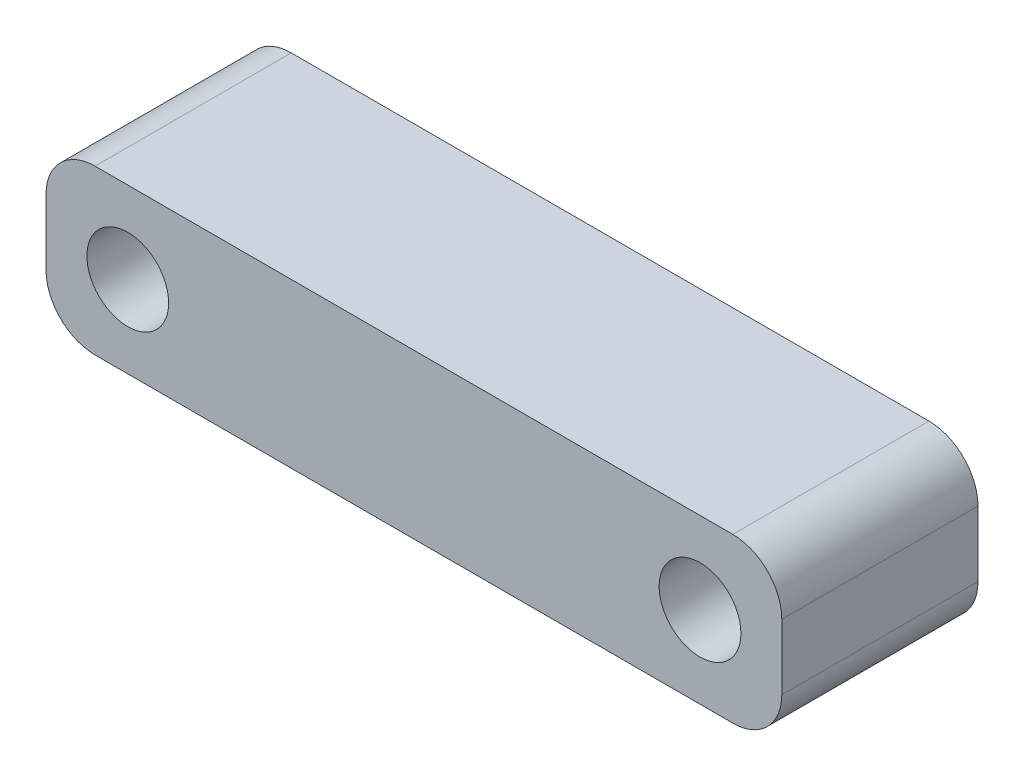
ISO-10303-21;
HEADER;
FILE_DESCRIPTION(('STEP AP214'),'2;1');
FILE_NAME('part.step','',(''),(''),'','','');
FILE_SCHEMA(('AUTOMOTIVE_DESIGN { 1 0 10303 214 1 1 1 1 }'));
ENDSEC;
DATA;
#1=APPLICATION_CONTEXT('core data for automotive mechanical design processes');
#2=APPLICATION_PROTOCOL_DEFINITION('international standard','automotive_design',2000,#1);
#3=PRODUCT_CONTEXT('',#1,'mechanical');
#4=PRODUCT('Part','Part','',(#3));
#5=PRODUCT_RELATED_PRODUCT_CATEGORY('part','',(#4));
#6=PRODUCT_DEFINITION_FORMATION('','',#4);
#7=PRODUCT_DEFINITION_CONTEXT('part definition',#1,'design');
#8=PRODUCT_DEFINITION('design','',#6,#7);
#9=PRODUCT_DEFINITION_SHAPE('','',#8);
#10=(LENGTH_UNIT() NAMED_UNIT(*) SI_UNIT(.MILLI.,.METRE.));
#11=(NAMED_UNIT(*) PLANE_ANGLE_UNIT() SI_UNIT($,.RADIAN.));
#12=(NAMED_UNIT(*) SI_UNIT($,.STERADIAN.) SOLID_ANGLE_UNIT());
#13=UNCERTAINTY_MEASURE_WITH_UNIT(LENGTH_MEASURE(1.E-05),#10,'distance_accuracy_value','');
#14=(GEOMETRIC_REPRESENTATION_CONTEXT(3) GLOBAL_UNCERTAINTY_ASSIGNED_CONTEXT((#13)) GLOBAL_UNIT_ASSIGNED_CONTEXT((#10,
#11,#12)) REPRESENTATION_CONTEXT('',''));
#15=CARTESIAN_POINT('',(0.,0.,0.));
#16=DIRECTION('',(0.,0.,1.));
#17=DIRECTION('',(1.,0.,0.));
#18=AXIS2_PLACEMENT_3D('',#15,#16,#17);
#19=CARTESIAN_POINT('',(37.,2.,12.));
#20=DIRECTION('',(0.,0.,-1.));
#21=DIRECTION('',(-1.,0.,0.));
#22=AXIS2_PLACEMENT_3D('',#19,#20,#21);
#23=PLANE('',#22);
#24=CARTESIAN_POINT('',(37.,2.,12.));
#25=DIRECTION('',(0.,0.,1.));
#26=DIRECTION('',(-1.,0.,0.));
#27=AXIS2_PLACEMENT_3D('',#24,#25,#26);
#28=CIRCLE('',#27,3.);
#29=CARTESIAN_POINT('',(40.,1.99999999999998,12.));
#30=VERTEX_POINT('',#29);
#31=CARTESIAN_POINT('',(37.,5.,12.));
#32=VERTEX_POINT('',#31);
#33=EDGE_CURVE('E151',#30,#32,#28,.T.);
#34=ORIENTED_EDGE('',*,*,#33,.T.);
#35=DIRECTION('',(-1.,0.,0.));
#36=VECTOR('',#35,1.);
#37=CARTESIAN_POINT('',(-1.99999999999998,5.,12.));
#38=LINE('',#37,#36);
#39=CARTESIAN_POINT('',(-1.99999999999998,5.,12.));
#40=VERTEX_POINT('',#39);
#41=EDGE_CURVE('E99',#32,#40,#38,.T.);
#42=ORIENTED_EDGE('',*,*,#41,.T.);
#43=CARTESIAN_POINT('',(-2.,2.,12.));
#44=DIRECTION('',(0.,0.,1.));
#45=DIRECTION('',(1.,0.,0.));
#46=AXIS2_PLACEMENT_3D('',#43,#44,#45);
#47=CIRCLE('',#46,3.);
#48=CARTESIAN_POINT('',(-5.,1.99999999999998,12.));
#49=VERTEX_POINT('',#48);
#50=EDGE_CURVE('E166',#40,#49,#47,.T.);
#51=ORIENTED_EDGE('',*,*,#50,.T.);
#52=DIRECTION('',(0.,-1.,0.));
#53=VECTOR('',#52,1.);
#54=CARTESIAN_POINT('',(-5.,1.99999999999998,12.));
#55=LINE('',#54,#53);
#56=CARTESIAN_POINT('',(-5.,-1.99999999999998,12.));
#57=VERTEX_POINT('',#56);
#58=EDGE_CURVE('E179',#49,#57,#55,.T.);
#59=ORIENTED_EDGE('',*,*,#58,.T.);
#60=CARTESIAN_POINT('',(-2.,-2.,12.));
#61=DIRECTION('',(0.,0.,1.));
#62=DIRECTION('',(1.,0.,0.));
#63=AXIS2_PLACEMENT_3D('',#60,#61,#62);
#64=CIRCLE('',#63,3.);
#65=CARTESIAN_POINT('',(-1.99999999999998,-5.,12.));
#66=VERTEX_POINT('',#65);
#67=EDGE_CURVE('E118',#57,#66,#64,.T.);
#68=ORIENTED_EDGE('',*,*,#67,.T.);
#69=DIRECTION('',(1.,0.,0.));
#70=VECTOR('',#69,1.);
#71=CARTESIAN_POINT('',(-1.99999999999998,-5.,12.));
#72=LINE('',#71,#70);
#73=CARTESIAN_POINT('',(37.,-5.,12.));
#74=VERTEX_POINT('',#73);
#75=EDGE_CURVE('E112',#66,#74,#72,.T.);
#76=ORIENTED_EDGE('',*,*,#75,.T.);
#77=CARTESIAN_POINT('',(37.,-2.,12.));
#78=DIRECTION('',(0.,0.,1.));
#79=DIRECTION('',(1.,0.,0.));
#80=AXIS2_PLACEMENT_3D('',#77,#78,#79);
#81=CIRCLE('',#80,3.);
#82=CARTESIAN_POINT('',(40.,-2.,12.));
#83=VERTEX_POINT('',#82);
#84=EDGE_CURVE('E116',#74,#83,#81,.T.);
#85=ORIENTED_EDGE('',*,*,#84,.T.);
#86=DIRECTION('',(0.,1.,0.));
#87=VECTOR('',#86,1.);
#88=CARTESIAN_POINT('',(40.,1.99999999999998,12.));
#89=LINE('',#88,#87);
#90=EDGE_CURVE('E56',#83,#30,#89,.T.);
#91=ORIENTED_EDGE('',*,*,#90,.T.);
#92=EDGE_LOOP('',(#34,#42,#51,#59,#68,#76,#85,#91));
#93=FACE_BOUND('',#92,.T.);
#94=CARTESIAN_POINT('',(0.,0.,12.));
#95=DIRECTION('',(0.,0.,1.));
#96=DIRECTION('',(1.,0.,0.));
#97=AXIS2_PLACEMENT_3D('',#94,#95,#96);
#98=CIRCLE('',#97,2.5);
#99=CARTESIAN_POINT('',(2.5,0.,12.));
#100=VERTEX_POINT('',#99);
#101=EDGE_CURVE('E140',#100,#100,#98,.T.);
#102=ORIENTED_EDGE('',*,*,#101,.F.);
#103=EDGE_LOOP('',(#102));
#104=FACE_BOUND('',#103,.T.);
#105=CARTESIAN_POINT('',(35.,0.,12.));
#106=DIRECTION('',(0.,0.,1.));
#107=DIRECTION('',(1.,0.,0.));
#108=AXIS2_PLACEMENT_3D('',#105,#106,#107);
#109=CIRCLE('',#108,2.5);
#110=CARTESIAN_POINT('',(37.5,0.,12.));
#111=VERTEX_POINT('',#110);
#112=EDGE_CURVE('E188',#111,#111,#109,.T.);
#113=ORIENTED_EDGE('',*,*,#112,.F.);
#114=EDGE_LOOP('',(#113));
#115=FACE_BOUND('',#114,.T.);
#116=ADVANCED_FACE('F39',(#93,#104,#115),#23,.F.);
#117=CARTESIAN_POINT('',(37.,2.,0.));
#118=DIRECTION('',(0.,0.,-1.));
#119=DIRECTION('',(-1.,0.,0.));
#120=AXIS2_PLACEMENT_3D('',#117,#118,#119);
#121=PLANE('',#120);
#122=CARTESIAN_POINT('',(0.,0.,0.));
#123=DIRECTION('',(0.,0.,1.));
#124=DIRECTION('',(1.,0.,0.));
#125=AXIS2_PLACEMENT_3D('',#122,#123,#124);
#126=CIRCLE('',#125,2.5);
#127=CARTESIAN_POINT('',(2.5,0.,0.));
#128=VERTEX_POINT('',#127);
#129=EDGE_CURVE('E185',#128,#128,#126,.T.);
#130=ORIENTED_EDGE('',*,*,#129,.T.);
#131=EDGE_LOOP('',(#130));
#132=FACE_BOUND('',#131,.T.);
#133=CARTESIAN_POINT('',(37.,2.,0.));
#134=DIRECTION('',(0.,0.,1.));
#135=DIRECTION('',(-1.,0.,0.));
#136=AXIS2_PLACEMENT_3D('',#133,#134,#135);
#137=CIRCLE('',#136,3.);
#138=CARTESIAN_POINT('',(40.,1.99999999999998,0.));
#139=VERTEX_POINT('',#138);
#140=CARTESIAN_POINT('',(37.,5.,0.));
#141=VERTEX_POINT('',#140);
#142=EDGE_CURVE('E136',#139,#141,#137,.T.);
#143=ORIENTED_EDGE('',*,*,#142,.F.);
#144=DIRECTION('',(0.,1.,0.));
#145=VECTOR('',#144,1.);
#146=CARTESIAN_POINT('',(40.,1.99999999999998,0.));
#147=LINE('',#146,#145);
#148=CARTESIAN_POINT('',(40.,-2.,0.));
#149=VERTEX_POINT('',#148);
#150=EDGE_CURVE('E91',#149,#139,#147,.T.);
#151=ORIENTED_EDGE('',*,*,#150,.F.);
#152=CARTESIAN_POINT('',(37.,-2.,0.));
#153=DIRECTION('',(0.,0.,1.));
#154=DIRECTION('',(1.,0.,0.));
#155=AXIS2_PLACEMENT_3D('',#152,#153,#154);
#156=CIRCLE('',#155,3.);
#157=CARTESIAN_POINT('',(37.,-5.,0.));
#158=VERTEX_POINT('',#157);
#159=EDGE_CURVE('E85',#158,#149,#156,.T.);
#160=ORIENTED_EDGE('',*,*,#159,.F.);
#161=DIRECTION('',(1.,0.,0.));
#162=VECTOR('',#161,1.);
#163=CARTESIAN_POINT('',(-1.99999999999998,-5.,0.));
#164=LINE('',#163,#162);
#165=CARTESIAN_POINT('',(-1.99999999999998,-5.,0.));
#166=VERTEX_POINT('',#165);
#167=EDGE_CURVE('E126',#166,#158,#164,.T.);
#168=ORIENTED_EDGE('',*,*,#167,.F.);
#169=CARTESIAN_POINT('',(-2.,-2.,0.));
#170=DIRECTION('',(0.,0.,1.));
#171=DIRECTION('',(1.,0.,0.));
#172=AXIS2_PLACEMENT_3D('',#169,#170,#171);
#173=CIRCLE('',#172,3.);
#174=CARTESIAN_POINT('',(-5.,-1.99999999999998,0.));
#175=VERTEX_POINT('',#174);
#176=EDGE_CURVE('E146',#175,#166,#173,.T.);
#177=ORIENTED_EDGE('',*,*,#176,.F.);
#178=DIRECTION('',(0.,-1.,0.));
#179=VECTOR('',#178,1.);
#180=CARTESIAN_POINT('',(-5.,1.99999999999998,0.));
#181=LINE('',#180,#179);
#182=CARTESIAN_POINT('',(-5.,1.99999999999998,0.));
#183=VERTEX_POINT('',#182);
#184=EDGE_CURVE('E144',#183,#175,#181,.T.);
#185=ORIENTED_EDGE('',*,*,#184,.F.);
#186=CARTESIAN_POINT('',(-2.,2.,0.));
#187=DIRECTION('',(0.,0.,1.));
#188=DIRECTION('',(1.,0.,0.));
#189=AXIS2_PLACEMENT_3D('',#186,#187,#188);
#190=CIRCLE('',#189,3.);
#191=CARTESIAN_POINT('',(-1.99999999999998,5.,0.));
#192=VERTEX_POINT('',#191);
#193=EDGE_CURVE('E142',#192,#183,#190,.T.);
#194=ORIENTED_EDGE('',*,*,#193,.F.);
#195=DIRECTION('',(-1.,0.,0.));
#196=VECTOR('',#195,1.);
#197=CARTESIAN_POINT('',(-1.99999999999998,5.,0.));
#198=LINE('',#197,#196);
#199=EDGE_CURVE('E139',#141,#192,#198,.T.);
#200=ORIENTED_EDGE('',*,*,#199,.F.);
#201=EDGE_LOOP('',(#143,#151,#160,#168,#177,#185,#194,#200));
#202=FACE_BOUND('',#201,.T.);
#203=CARTESIAN_POINT('',(35.,0.,0.));
#204=DIRECTION('',(0.,0.,1.));
#205=DIRECTION('',(1.,0.,0.));
#206=AXIS2_PLACEMENT_3D('',#203,#204,#205);
#207=CIRCLE('',#206,2.5);
#208=CARTESIAN_POINT('',(37.5,0.,0.));
#209=VERTEX_POINT('',#208);
#210=EDGE_CURVE('E191',#209,#209,#207,.T.);
#211=ORIENTED_EDGE('',*,*,#210,.T.);
#212=EDGE_LOOP('',(#211));
#213=FACE_BOUND('',#212,.T.);
#214=ADVANCED_FACE('F170',(#132,#202,#213),#121,.T.);
#215=CARTESIAN_POINT('',(37.,2.,12.));
#216=DIRECTION('',(0.,0.,-1.));
#217=DIRECTION('',(-1.,0.,0.));
#218=AXIS2_PLACEMENT_3D('',#215,#216,#217);
#219=CYLINDRICAL_SURFACE('',#218,3.);
#220=ORIENTED_EDGE('',*,*,#142,.T.);
#221=DIRECTION('',(0.,0.,-1.));
#222=VECTOR('',#221,1.);
#223=CARTESIAN_POINT('',(37.,5.,12.));
#224=LINE('',#223,#222);
#225=EDGE_CURVE('E11',#32,#141,#224,.T.);
#226=ORIENTED_EDGE('',*,*,#225,.F.);
#227=ORIENTED_EDGE('',*,*,#33,.F.);
#228=DIRECTION('',(0.,0.,-1.));
#229=VECTOR('',#228,1.);
#230=CARTESIAN_POINT('',(40.,1.99999999999998,12.));
#231=LINE('',#230,#229);
#232=EDGE_CURVE('E132',#30,#139,#231,.T.);
#233=ORIENTED_EDGE('',*,*,#232,.T.);
#234=EDGE_LOOP('',(#220,#226,#227,#233));
#235=FACE_BOUND('',#234,.T.);
#236=ADVANCED_FACE('F41',(#235),#219,.T.);
#237=CARTESIAN_POINT('',(-1.99999999999998,5.,12.));
#238=DIRECTION('',(0.,-1.,0.));
#239=DIRECTION('',(0.,0.,-1.));
#240=AXIS2_PLACEMENT_3D('',#237,#238,#239);
#241=PLANE('',#240);
#242=ORIENTED_EDGE('',*,*,#199,.T.);
#243=DIRECTION('',(0.,0.,-1.));
#244=VECTOR('',#243,1.);
#245=CARTESIAN_POINT('',(-1.99999999999998,5.,12.));
#246=LINE('',#245,#244);
#247=EDGE_CURVE('E48',#40,#192,#246,.T.);
#248=ORIENTED_EDGE('',*,*,#247,.F.);
#249=ORIENTED_EDGE('',*,*,#41,.F.);
#250=ORIENTED_EDGE('',*,*,#225,.T.);
#251=EDGE_LOOP('',(#242,#248,#249,#250));
#252=FACE_BOUND('',#251,.T.);
#253=ADVANCED_FACE('F223',(#252),#241,.F.);
#254=CARTESIAN_POINT('',(-2.,2.,12.));
#255=DIRECTION('',(0.,0.,-1.));
#256=DIRECTION('',(-1.,0.,0.));
#257=AXIS2_PLACEMENT_3D('',#254,#255,#256);
#258=CYLINDRICAL_SURFACE('',#257,3.);
#259=ORIENTED_EDGE('',*,*,#193,.T.);
#260=DIRECTION('',(0.,0.,-1.));
#261=VECTOR('',#260,1.);
#262=CARTESIAN_POINT('',(-5.,1.99999999999998,12.));
#263=LINE('',#262,#261);
#264=EDGE_CURVE('E158',#49,#183,#263,.T.);
#265=ORIENTED_EDGE('',*,*,#264,.F.);
#266=ORIENTED_EDGE('',*,*,#50,.F.);
#267=ORIENTED_EDGE('',*,*,#247,.T.);
#268=EDGE_LOOP('',(#259,#265,#266,#267));
#269=FACE_BOUND('',#268,.T.);
#270=ADVANCED_FACE('F164',(#269),#258,.T.);
#271=CARTESIAN_POINT('',(-5.,1.99999999999998,12.));
#272=DIRECTION('',(1.,0.,0.));
#273=DIRECTION('',(0.,1.,0.));
#274=AXIS2_PLACEMENT_3D('',#271,#272,#273);
#275=PLANE('',#274);
#276=ORIENTED_EDGE('',*,*,#184,.T.);
#277=DIRECTION('',(0.,0.,-1.));
#278=VECTOR('',#277,1.);
#279=CARTESIAN_POINT('',(-5.,-1.99999999999998,12.));
#280=LINE('',#279,#278);
#281=EDGE_CURVE('E155',#57,#175,#280,.T.);
#282=ORIENTED_EDGE('',*,*,#281,.F.);
#283=ORIENTED_EDGE('',*,*,#58,.F.);
#284=ORIENTED_EDGE('',*,*,#264,.T.);
#285=EDGE_LOOP('',(#276,#282,#283,#284));
#286=FACE_BOUND('',#285,.T.);
#287=ADVANCED_FACE('F175',(#286),#275,.F.);
#288=CARTESIAN_POINT('',(-2.,-2.,12.));
#289=DIRECTION('',(0.,0.,-1.));
#290=DIRECTION('',(-1.,0.,0.));
#291=AXIS2_PLACEMENT_3D('',#288,#289,#290);
#292=CYLINDRICAL_SURFACE('',#291,3.);
#293=ORIENTED_EDGE('',*,*,#176,.T.);
#294=DIRECTION('',(0.,0.,-1.));
#295=VECTOR('',#294,1.);
#296=CARTESIAN_POINT('',(-1.99999999999998,-5.,12.));
#297=LINE('',#296,#295);
#298=EDGE_CURVE('E127',#66,#166,#297,.T.);
#299=ORIENTED_EDGE('',*,*,#298,.F.);
#300=ORIENTED_EDGE('',*,*,#67,.F.);
#301=ORIENTED_EDGE('',*,*,#281,.T.);
#302=EDGE_LOOP('',(#293,#299,#300,#301));
#303=FACE_BOUND('',#302,.T.);
#304=ADVANCED_FACE('F178',(#303),#292,.T.);
#305=CARTESIAN_POINT('',(-1.99999999999998,-5.,12.));
#306=DIRECTION('',(0.,1.,0.));
#307=DIRECTION('',(0.,0.,1.));
#308=AXIS2_PLACEMENT_3D('',#305,#306,#307);
#309=PLANE('',#308);
#310=ORIENTED_EDGE('',*,*,#167,.T.);
#311=DIRECTION('',(0.,0.,-1.));
#312=VECTOR('',#311,1.);
#313=CARTESIAN_POINT('',(37.,-5.,12.));
#314=LINE('',#313,#312);
#315=EDGE_CURVE('E123',#74,#158,#314,.T.);
#316=ORIENTED_EDGE('',*,*,#315,.F.);
#317=ORIENTED_EDGE('',*,*,#75,.F.);
#318=ORIENTED_EDGE('',*,*,#298,.T.);
#319=EDGE_LOOP('',(#310,#316,#317,#318));
#320=FACE_BOUND('',#319,.T.);
#321=ADVANCED_FACE('F124',(#320),#309,.F.);
#322=CARTESIAN_POINT('',(37.,-2.,12.));
#323=DIRECTION('',(0.,0.,-1.));
#324=DIRECTION('',(-1.,0.,0.));
#325=AXIS2_PLACEMENT_3D('',#322,#323,#324);
#326=CYLINDRICAL_SURFACE('',#325,3.);
#327=ORIENTED_EDGE('',*,*,#159,.T.);
#328=DIRECTION('',(0.,0.,-1.));
#329=VECTOR('',#328,1.);
#330=CARTESIAN_POINT('',(40.,-2.,12.));
#331=LINE('',#330,#329);
#332=EDGE_CURVE('E128',#83,#149,#331,.T.);
#333=ORIENTED_EDGE('',*,*,#332,.F.);
#334=ORIENTED_EDGE('',*,*,#84,.F.);
#335=ORIENTED_EDGE('',*,*,#315,.T.);
#336=EDGE_LOOP('',(#327,#333,#334,#335));
#337=FACE_BOUND('',#336,.T.);
#338=ADVANCED_FACE('F130',(#337),#326,.T.);
#339=CARTESIAN_POINT('',(40.,1.99999999999998,12.));
#340=DIRECTION('',(-1.,0.,0.));
#341=DIRECTION('',(0.,0.,1.));
#342=AXIS2_PLACEMENT_3D('',#339,#340,#341);
#343=PLANE('',#342);
#344=ORIENTED_EDGE('',*,*,#150,.T.);
#345=ORIENTED_EDGE('',*,*,#232,.F.);
#346=ORIENTED_EDGE('',*,*,#90,.F.);
#347=ORIENTED_EDGE('',*,*,#332,.T.);
#348=EDGE_LOOP('',(#344,#345,#346,#347));
#349=FACE_BOUND('',#348,.T.);
#350=ADVANCED_FACE('F211',(#349),#343,.F.);
#351=CARTESIAN_POINT('',(0.,0.,12.));
#352=DIRECTION('',(0.,0.,-1.));
#353=DIRECTION('',(-1.,0.,0.));
#354=AXIS2_PLACEMENT_3D('',#351,#352,#353);
#355=CYLINDRICAL_SURFACE('',#354,2.5);
#356=ORIENTED_EDGE('',*,*,#101,.T.);
#357=EDGE_LOOP('',(#356));
#358=FACE_BOUND('',#357,.T.);
#359=ORIENTED_EDGE('',*,*,#129,.F.);
#360=EDGE_LOOP('',(#359));
#361=FACE_BOUND('',#360,.T.);
#362=ADVANCED_FACE('F208',(#358,#361),#355,.F.);
#363=CARTESIAN_POINT('',(35.,0.,12.));
#364=DIRECTION('',(0.,0.,-1.));
#365=DIRECTION('',(-1.,0.,0.));
#366=AXIS2_PLACEMENT_3D('',#363,#364,#365);
#367=CYLINDRICAL_SURFACE('',#366,2.5);
#368=ORIENTED_EDGE('',*,*,#112,.T.);
#369=EDGE_LOOP('',(#368));
#370=FACE_BOUND('',#369,.T.);
#371=ORIENTED_EDGE('',*,*,#210,.F.);
#372=EDGE_LOOP('',(#371));
#373=FACE_BOUND('',#372,.T.);
#374=ADVANCED_FACE('F197',(#370,#373),#367,.F.);
#375=CLOSED_SHELL('',(#116,#214,#236,#253,#270,#287,#304,#321,#338,#350,#362,#374));
#376=MANIFOLD_SOLID_BREP('B2',#375);
#377=ADVANCED_BREP_SHAPE_REPRESENTATION('',(#18,#376),#14);
#378=SHAPE_DEFINITION_REPRESENTATION(#9,#377);
ENDSEC;
END-ISO-10303-21;
